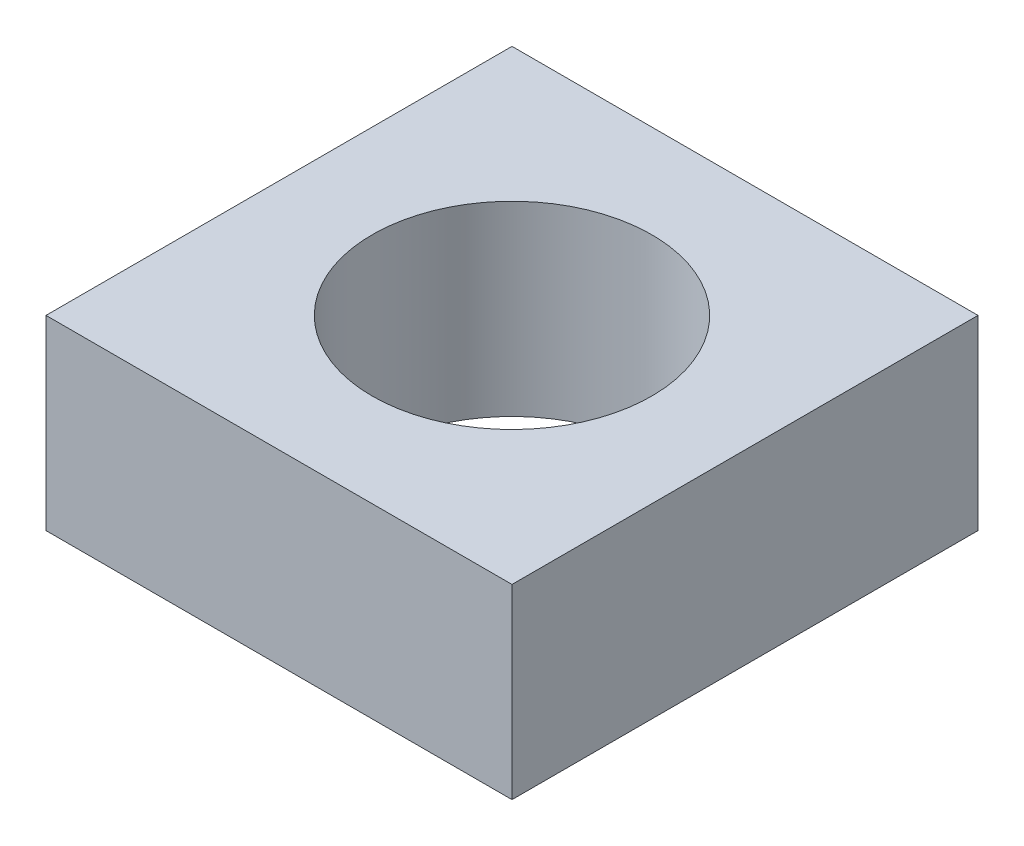
ISO-10303-21;
HEADER;
FILE_DESCRIPTION(('STEP AP214'),'2;1');
FILE_NAME('part.step','',(''),(''),'','','');
FILE_SCHEMA(('AUTOMOTIVE_DESIGN { 1 0 10303 214 1 1 1 1 }'));
ENDSEC;
DATA;
#1=APPLICATION_CONTEXT('core data for automotive mechanical design processes');
#2=APPLICATION_PROTOCOL_DEFINITION('international standard','automotive_design',2000,#1);
#3=PRODUCT_CONTEXT('',#1,'mechanical');
#4=PRODUCT('Part','Part','',(#3));
#5=PRODUCT_RELATED_PRODUCT_CATEGORY('part','',(#4));
#6=PRODUCT_DEFINITION_FORMATION('','',#4);
#7=PRODUCT_DEFINITION_CONTEXT('part definition',#1,'design');
#8=PRODUCT_DEFINITION('design','',#6,#7);
#9=PRODUCT_DEFINITION_SHAPE('','',#8);
#10=(LENGTH_UNIT() NAMED_UNIT(*) SI_UNIT(.MILLI.,.METRE.));
#11=(NAMED_UNIT(*) PLANE_ANGLE_UNIT() SI_UNIT($,.RADIAN.));
#12=(NAMED_UNIT(*) SI_UNIT($,.STERADIAN.) SOLID_ANGLE_UNIT());
#13=UNCERTAINTY_MEASURE_WITH_UNIT(LENGTH_MEASURE(1.E-05),#10,'distance_accuracy_value','');
#14=(GEOMETRIC_REPRESENTATION_CONTEXT(3) GLOBAL_UNCERTAINTY_ASSIGNED_CONTEXT((#13)) GLOBAL_UNIT_ASSIGNED_CONTEXT((#10,
#11,#12)) REPRESENTATION_CONTEXT('',''));
#15=CARTESIAN_POINT('',(0.,0.,0.));
#16=DIRECTION('',(0.,0.,1.));
#17=DIRECTION('',(1.,0.,0.));
#18=AXIS2_PLACEMENT_3D('',#15,#16,#17);
#19=CARTESIAN_POINT('',(-7.9375,3.175,7.9375));
#20=DIRECTION('',(0.,1.,0.));
#21=DIRECTION('',(0.,0.,1.));
#22=AXIS2_PLACEMENT_3D('',#19,#20,#21);
#23=PLANE('',#22);
#24=DIRECTION('',(0.,0.,1.));
#25=VECTOR('',#24,1.);
#26=CARTESIAN_POINT('',(-7.9375,3.175,-7.9375));
#27=LINE('',#26,#25);
#28=CARTESIAN_POINT('',(-7.9375,3.175,-7.9375));
#29=VERTEX_POINT('',#28);
#30=CARTESIAN_POINT('',(-7.9375,3.175,7.9375));
#31=VERTEX_POINT('',#30);
#32=EDGE_CURVE('E92',#29,#31,#27,.T.);
#33=ORIENTED_EDGE('',*,*,#32,.T.);
#34=DIRECTION('',(1.,0.,0.));
#35=VECTOR('',#34,1.);
#36=CARTESIAN_POINT('',(-7.9375,3.175,7.9375));
#37=LINE('',#36,#35);
#38=CARTESIAN_POINT('',(7.9375,3.175,7.9375));
#39=VERTEX_POINT('',#38);
#40=EDGE_CURVE('E87',#31,#39,#37,.T.);
#41=ORIENTED_EDGE('',*,*,#40,.T.);
#42=DIRECTION('',(0.,0.,-1.));
#43=VECTOR('',#42,1.);
#44=CARTESIAN_POINT('',(7.9375,3.175,-7.9375));
#45=LINE('',#44,#43);
#46=CARTESIAN_POINT('',(7.9375,3.175,-7.9375));
#47=VERTEX_POINT('',#46);
#48=EDGE_CURVE('E90',#39,#47,#45,.T.);
#49=ORIENTED_EDGE('',*,*,#48,.T.);
#50=DIRECTION('',(-1.,0.,0.));
#51=VECTOR('',#50,1.);
#52=CARTESIAN_POINT('',(-7.9375,3.175,-7.9375));
#53=LINE('',#52,#51);
#54=EDGE_CURVE('E57',#47,#29,#53,.T.);
#55=ORIENTED_EDGE('',*,*,#54,.T.);
#56=EDGE_LOOP('',(#33,#41,#49,#55));
#57=FACE_BOUND('',#56,.T.);
#58=CARTESIAN_POINT('',(0.,3.175,0.));
#59=DIRECTION('',(0.,1.,0.));
#60=DIRECTION('',(0.,0.,1.));
#61=AXIS2_PLACEMENT_3D('',#58,#59,#60);
#62=CIRCLE('',#61,4.7625);
#63=CARTESIAN_POINT('',(0.,3.175,4.7625));
#64=VERTEX_POINT('',#63);
#65=EDGE_CURVE('E112',#64,#64,#62,.T.);
#66=ORIENTED_EDGE('',*,*,#65,.F.);
#67=EDGE_LOOP('',(#66));
#68=FACE_BOUND('',#67,.T.);
#69=ADVANCED_FACE('F39',(#57,#68),#23,.T.);
#70=CARTESIAN_POINT('',(-7.9375,-3.175,7.9375));
#71=DIRECTION('',(0.,1.,0.));
#72=DIRECTION('',(0.,0.,1.));
#73=AXIS2_PLACEMENT_3D('',#70,#71,#72);
#74=PLANE('',#73);
#75=DIRECTION('',(0.,0.,1.));
#76=VECTOR('',#75,1.);
#77=CARTESIAN_POINT('',(-7.9375,-3.175,-7.9375));
#78=LINE('',#77,#76);
#79=CARTESIAN_POINT('',(-7.9375,-3.175,-7.9375));
#80=VERTEX_POINT('',#79);
#81=CARTESIAN_POINT('',(-7.9375,-3.175,7.9375));
#82=VERTEX_POINT('',#81);
#83=EDGE_CURVE('E108',#80,#82,#78,.T.);
#84=ORIENTED_EDGE('',*,*,#83,.F.);
#85=DIRECTION('',(-1.,0.,0.));
#86=VECTOR('',#85,1.);
#87=CARTESIAN_POINT('',(-7.9375,-3.175,-7.9375));
#88=LINE('',#87,#86);
#89=CARTESIAN_POINT('',(7.9375,-3.175,-7.9375));
#90=VERTEX_POINT('',#89);
#91=EDGE_CURVE('E80',#90,#80,#88,.T.);
#92=ORIENTED_EDGE('',*,*,#91,.F.);
#93=DIRECTION('',(0.,0.,-1.));
#94=VECTOR('',#93,1.);
#95=CARTESIAN_POINT('',(7.9375,-3.175,-7.9375));
#96=LINE('',#95,#94);
#97=CARTESIAN_POINT('',(7.9375,-3.175,7.9375));
#98=VERTEX_POINT('',#97);
#99=EDGE_CURVE('E74',#98,#90,#96,.T.);
#100=ORIENTED_EDGE('',*,*,#99,.F.);
#101=DIRECTION('',(1.,0.,0.));
#102=VECTOR('',#101,1.);
#103=CARTESIAN_POINT('',(-7.9375,-3.175,7.9375));
#104=LINE('',#103,#102);
#105=EDGE_CURVE('E97',#82,#98,#104,.T.);
#106=ORIENTED_EDGE('',*,*,#105,.F.);
#107=EDGE_LOOP('',(#84,#92,#100,#106));
#108=FACE_BOUND('',#107,.T.);
#109=CARTESIAN_POINT('',(0.,-3.175,0.));
#110=DIRECTION('',(0.,1.,0.));
#111=DIRECTION('',(0.,0.,1.));
#112=AXIS2_PLACEMENT_3D('',#109,#110,#111);
#113=CIRCLE('',#112,4.7625);
#114=CARTESIAN_POINT('',(0.,-3.175,4.7625));
#115=VERTEX_POINT('',#114);
#116=EDGE_CURVE('E130',#115,#115,#113,.T.);
#117=ORIENTED_EDGE('',*,*,#116,.T.);
#118=EDGE_LOOP('',(#117));
#119=FACE_BOUND('',#118,.T.);
#120=ADVANCED_FACE('F125',(#108,#119),#74,.F.);
#121=CARTESIAN_POINT('',(-7.9375,3.175,-7.9375));
#122=DIRECTION('',(1.,0.,0.));
#123=DIRECTION('',(0.,0.,-1.));
#124=AXIS2_PLACEMENT_3D('',#121,#122,#123);
#125=PLANE('',#124);
#126=ORIENTED_EDGE('',*,*,#83,.T.);
#127=DIRECTION('',(0.,-1.,0.));
#128=VECTOR('',#127,1.);
#129=CARTESIAN_POINT('',(-7.9375,3.175,7.9375));
#130=LINE('',#129,#128);
#131=EDGE_CURVE('E11',#31,#82,#130,.T.);
#132=ORIENTED_EDGE('',*,*,#131,.F.);
#133=ORIENTED_EDGE('',*,*,#32,.F.);
#134=DIRECTION('',(0.,-1.,0.));
#135=VECTOR('',#134,1.);
#136=CARTESIAN_POINT('',(-7.9375,3.175,-7.9375));
#137=LINE('',#136,#135);
#138=EDGE_CURVE('E104',#29,#80,#137,.T.);
#139=ORIENTED_EDGE('',*,*,#138,.T.);
#140=EDGE_LOOP('',(#126,#132,#133,#139));
#141=FACE_BOUND('',#140,.T.);
#142=ADVANCED_FACE('F41',(#141),#125,.F.);
#143=CARTESIAN_POINT('',(-7.9375,3.175,7.9375));
#144=DIRECTION('',(0.,0.,-1.));
#145=DIRECTION('',(-1.,0.,0.));
#146=AXIS2_PLACEMENT_3D('',#143,#144,#145);
#147=PLANE('',#146);
#148=ORIENTED_EDGE('',*,*,#105,.T.);
#149=DIRECTION('',(0.,-1.,0.));
#150=VECTOR('',#149,1.);
#151=CARTESIAN_POINT('',(7.9375,3.175,7.9375));
#152=LINE('',#151,#150);
#153=EDGE_CURVE('E49',#39,#98,#152,.T.);
#154=ORIENTED_EDGE('',*,*,#153,.F.);
#155=ORIENTED_EDGE('',*,*,#40,.F.);
#156=ORIENTED_EDGE('',*,*,#131,.T.);
#157=EDGE_LOOP('',(#148,#154,#155,#156));
#158=FACE_BOUND('',#157,.T.);
#159=ADVANCED_FACE('F96',(#158),#147,.F.);
#160=CARTESIAN_POINT('',(7.9375,3.175,-7.9375));
#161=DIRECTION('',(-1.,0.,0.));
#162=DIRECTION('',(0.,0.,1.));
#163=AXIS2_PLACEMENT_3D('',#160,#161,#162);
#164=PLANE('',#163);
#165=ORIENTED_EDGE('',*,*,#99,.T.);
#166=DIRECTION('',(0.,-1.,0.));
#167=VECTOR('',#166,1.);
#168=CARTESIAN_POINT('',(7.9375,3.175,-7.9375));
#169=LINE('',#168,#167);
#170=EDGE_CURVE('E99',#47,#90,#169,.T.);
#171=ORIENTED_EDGE('',*,*,#170,.F.);
#172=ORIENTED_EDGE('',*,*,#48,.F.);
#173=ORIENTED_EDGE('',*,*,#153,.T.);
#174=EDGE_LOOP('',(#165,#171,#172,#173));
#175=FACE_BOUND('',#174,.T.);
#176=ADVANCED_FACE('F100',(#175),#164,.F.);
#177=CARTESIAN_POINT('',(-7.9375,3.175,-7.9375));
#178=DIRECTION('',(0.,0.,1.));
#179=DIRECTION('',(1.,0.,0.));
#180=AXIS2_PLACEMENT_3D('',#177,#178,#179);
#181=PLANE('',#180);
#182=ORIENTED_EDGE('',*,*,#91,.T.);
#183=ORIENTED_EDGE('',*,*,#138,.F.);
#184=ORIENTED_EDGE('',*,*,#54,.F.);
#185=ORIENTED_EDGE('',*,*,#170,.T.);
#186=EDGE_LOOP('',(#182,#183,#184,#185));
#187=FACE_BOUND('',#186,.T.);
#188=ADVANCED_FACE('F122',(#187),#181,.F.);
#189=CARTESIAN_POINT('',(0.,3.175,0.));
#190=DIRECTION('',(0.,-1.,0.));
#191=DIRECTION('',(0.,0.,-1.));
#192=AXIS2_PLACEMENT_3D('',#189,#190,#191);
#193=CYLINDRICAL_SURFACE('',#192,4.7625);
#194=ORIENTED_EDGE('',*,*,#116,.F.);
#195=EDGE_LOOP('',(#194));
#196=FACE_BOUND('',#195,.T.);
#197=ORIENTED_EDGE('',*,*,#65,.T.);
#198=EDGE_LOOP('',(#197));
#199=FACE_BOUND('',#198,.T.);
#200=ADVANCED_FACE('F138',(#196,#199),#193,.F.);
#201=CLOSED_SHELL('',(#69,#120,#142,#159,#176,#188,#200));
#202=MANIFOLD_SOLID_BREP('B2',#201);
#203=ADVANCED_BREP_SHAPE_REPRESENTATION('',(#18,#202),#14);
#204=SHAPE_DEFINITION_REPRESENTATION(#9,#203);
ENDSEC;
END-ISO-10303-21;
